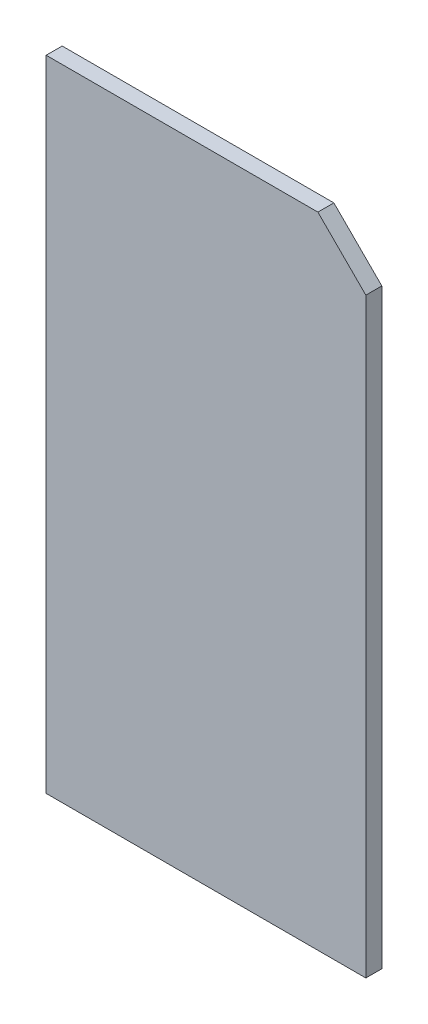
ISO-10303-21;
HEADER;
FILE_DESCRIPTION(('STEP AP214'),'2;1');
FILE_NAME('part.step','',(''),(''),'','','');
FILE_SCHEMA(('AUTOMOTIVE_DESIGN { 1 0 10303 214 1 1 1 1 }'));
ENDSEC;
DATA;
#1=APPLICATION_CONTEXT('core data for automotive mechanical design processes');
#2=APPLICATION_PROTOCOL_DEFINITION('international standard','automotive_design',2000,#1);
#3=PRODUCT_CONTEXT('',#1,'mechanical');
#4=PRODUCT('Part','Part','',(#3));
#5=PRODUCT_RELATED_PRODUCT_CATEGORY('part','',(#4));
#6=PRODUCT_DEFINITION_FORMATION('','',#4);
#7=PRODUCT_DEFINITION_CONTEXT('part definition',#1,'design');
#8=PRODUCT_DEFINITION('design','',#6,#7);
#9=PRODUCT_DEFINITION_SHAPE('','',#8);
#10=(LENGTH_UNIT() NAMED_UNIT(*) SI_UNIT(.MILLI.,.METRE.));
#11=(NAMED_UNIT(*) PLANE_ANGLE_UNIT() SI_UNIT($,.RADIAN.));
#12=(NAMED_UNIT(*) SI_UNIT($,.STERADIAN.) SOLID_ANGLE_UNIT());
#13=UNCERTAINTY_MEASURE_WITH_UNIT(LENGTH_MEASURE(1.E-05),#10,'distance_accuracy_value','');
#14=(GEOMETRIC_REPRESENTATION_CONTEXT(3) GLOBAL_UNCERTAINTY_ASSIGNED_CONTEXT((#13)) GLOBAL_UNIT_ASSIGNED_CONTEXT((#10,
#11,#12)) REPRESENTATION_CONTEXT('',''));
#15=CARTESIAN_POINT('',(0.,0.,0.));
#16=DIRECTION('',(0.,0.,1.));
#17=DIRECTION('',(1.,0.,0.));
#18=AXIS2_PLACEMENT_3D('',#15,#16,#17);
#19=CARTESIAN_POINT('',(-250.,-500.,25.));
#20=DIRECTION('',(1.,0.,0.));
#21=DIRECTION('',(0.,0.,-1.));
#22=AXIS2_PLACEMENT_3D('',#19,#20,#21);
#23=PLANE('',#22);
#24=DIRECTION('',(0.,-1.,0.));
#25=VECTOR('',#24,1.);
#26=CARTESIAN_POINT('',(-250.,-500.,0.));
#27=LINE('',#26,#25);
#28=CARTESIAN_POINT('',(-250.,500.,0.));
#29=VERTEX_POINT('',#28);
#30=CARTESIAN_POINT('',(-250.,-500.,0.));
#31=VERTEX_POINT('',#30);
#32=EDGE_CURVE('E116',#29,#31,#27,.T.);
#33=ORIENTED_EDGE('',*,*,#32,.T.);
#34=DIRECTION('',(0.,0.,-1.));
#35=VECTOR('',#34,1.);
#36=CARTESIAN_POINT('',(-250.,-500.,25.));
#37=LINE('',#36,#35);
#38=CARTESIAN_POINT('',(-250.,-500.,25.));
#39=VERTEX_POINT('',#38);
#40=EDGE_CURVE('E47',#39,#31,#37,.T.);
#41=ORIENTED_EDGE('',*,*,#40,.F.);
#42=DIRECTION('',(0.,-1.,0.));
#43=VECTOR('',#42,1.);
#44=CARTESIAN_POINT('',(-250.,-500.,25.));
#45=LINE('',#44,#43);
#46=CARTESIAN_POINT('',(-250.,500.,25.));
#47=VERTEX_POINT('',#46);
#48=EDGE_CURVE('E128',#47,#39,#45,.T.);
#49=ORIENTED_EDGE('',*,*,#48,.F.);
#50=DIRECTION('',(0.,0.,-1.));
#51=VECTOR('',#50,1.);
#52=CARTESIAN_POINT('',(-250.,500.,25.));
#53=LINE('',#52,#51);
#54=EDGE_CURVE('E105',#47,#29,#53,.T.);
#55=ORIENTED_EDGE('',*,*,#54,.T.);
#56=EDGE_LOOP('',(#33,#41,#49,#55));
#57=FACE_BOUND('',#56,.T.);
#58=ADVANCED_FACE('F39',(#57),#23,.F.);
#59=CARTESIAN_POINT('',(-250.,-500.,25.));
#60=DIRECTION('',(0.,1.,0.));
#61=DIRECTION('',(0.,0.,1.));
#62=AXIS2_PLACEMENT_3D('',#59,#60,#61);
#63=PLANE('',#62);
#64=DIRECTION('',(1.,0.,0.));
#65=VECTOR('',#64,1.);
#66=CARTESIAN_POINT('',(-250.,-500.,0.));
#67=LINE('',#66,#65);
#68=CARTESIAN_POINT('',(250.,-500.,0.));
#69=VERTEX_POINT('',#68);
#70=EDGE_CURVE('E120',#31,#69,#67,.T.);
#71=ORIENTED_EDGE('',*,*,#70,.T.);
#72=DIRECTION('',(0.,0.,-1.));
#73=VECTOR('',#72,1.);
#74=CARTESIAN_POINT('',(250.,-500.,25.));
#75=LINE('',#74,#73);
#76=CARTESIAN_POINT('',(250.,-500.,25.));
#77=VERTEX_POINT('',#76);
#78=EDGE_CURVE('E111',#77,#69,#75,.T.);
#79=ORIENTED_EDGE('',*,*,#78,.F.);
#80=DIRECTION('',(1.,0.,0.));
#81=VECTOR('',#80,1.);
#82=CARTESIAN_POINT('',(-250.,-500.,25.));
#83=LINE('',#82,#81);
#84=EDGE_CURVE('E86',#39,#77,#83,.T.);
#85=ORIENTED_EDGE('',*,*,#84,.F.);
#86=ORIENTED_EDGE('',*,*,#40,.T.);
#87=EDGE_LOOP('',(#71,#79,#85,#86));
#88=FACE_BOUND('',#87,.T.);
#89=ADVANCED_FACE('F134',(#88),#63,.F.);
#90=CARTESIAN_POINT('',(250.,500.,25.));
#91=DIRECTION('',(-1.,0.,0.));
#92=DIRECTION('',(0.,-1.,0.));
#93=AXIS2_PLACEMENT_3D('',#90,#91,#92);
#94=PLANE('',#93);
#95=DIRECTION('',(0.,1.,0.));
#96=VECTOR('',#95,1.);
#97=CARTESIAN_POINT('',(250.,500.,0.));
#98=LINE('',#97,#96);
#99=CARTESIAN_POINT('',(250.,425.,0.));
#100=VERTEX_POINT('',#99);
#101=EDGE_CURVE('E123',#69,#100,#98,.T.);
#102=ORIENTED_EDGE('',*,*,#101,.T.);
#103=DIRECTION('',(0.,0.,1.));
#104=VECTOR('',#103,1.);
#105=CARTESIAN_POINT('',(250.,425.,-0.399999999999998));
#106=LINE('',#105,#104);
#107=CARTESIAN_POINT('',(250.,425.,25.));
#108=VERTEX_POINT('',#107);
#109=EDGE_CURVE('E53',#100,#108,#106,.T.);
#110=ORIENTED_EDGE('',*,*,#109,.T.);
#111=DIRECTION('',(0.,1.,0.));
#112=VECTOR('',#111,1.);
#113=CARTESIAN_POINT('',(250.,500.,25.));
#114=LINE('',#113,#112);
#115=EDGE_CURVE('E101',#77,#108,#114,.T.);
#116=ORIENTED_EDGE('',*,*,#115,.F.);
#117=ORIENTED_EDGE('',*,*,#78,.T.);
#118=EDGE_LOOP('',(#102,#110,#116,#117));
#119=FACE_BOUND('',#118,.T.);
#120=ADVANCED_FACE('F141',(#119),#94,.F.);
#121=CARTESIAN_POINT('',(-250.,500.,25.));
#122=DIRECTION('',(0.,-1.,0.));
#123=DIRECTION('',(0.,0.,-1.));
#124=AXIS2_PLACEMENT_3D('',#121,#122,#123);
#125=PLANE('',#124);
#126=DIRECTION('',(-1.,0.,0.));
#127=VECTOR('',#126,1.);
#128=CARTESIAN_POINT('',(-250.,500.,25.));
#129=LINE('',#128,#127);
#130=CARTESIAN_POINT('',(175.,500.,25.));
#131=VERTEX_POINT('',#130);
#132=EDGE_CURVE('E62',#131,#47,#129,.T.);
#133=ORIENTED_EDGE('',*,*,#132,.F.);
#134=DIRECTION('',(0.,0.,1.));
#135=VECTOR('',#134,1.);
#136=CARTESIAN_POINT('',(175.,500.,-0.399999999999998));
#137=LINE('',#136,#135);
#138=CARTESIAN_POINT('',(175.,500.,0.));
#139=VERTEX_POINT('',#138);
#140=EDGE_CURVE('E93',#139,#131,#137,.T.);
#141=ORIENTED_EDGE('',*,*,#140,.F.);
#142=DIRECTION('',(-1.,0.,0.));
#143=VECTOR('',#142,1.);
#144=CARTESIAN_POINT('',(-250.,500.,0.));
#145=LINE('',#144,#143);
#146=EDGE_CURVE('E80',#139,#29,#145,.T.);
#147=ORIENTED_EDGE('',*,*,#146,.T.);
#148=ORIENTED_EDGE('',*,*,#54,.F.);
#149=EDGE_LOOP('',(#133,#141,#147,#148));
#150=FACE_BOUND('',#149,.T.);
#151=ADVANCED_FACE('F104',(#150),#125,.F.);
#152=CARTESIAN_POINT('',(0.,0.,25.));
#153=DIRECTION('',(0.,0.,-1.));
#154=DIRECTION('',(-1.,0.,0.));
#155=AXIS2_PLACEMENT_3D('',#152,#153,#154);
#156=PLANE('',#155);
#157=ORIENTED_EDGE('',*,*,#115,.T.);
#158=DIRECTION('',(0.707106781186548,-0.707106781186548,0.));
#159=VECTOR('',#158,1.);
#160=CARTESIAN_POINT('',(175.,500.,25.));
#161=LINE('',#160,#159);
#162=EDGE_CURVE('E95',#131,#108,#161,.T.);
#163=ORIENTED_EDGE('',*,*,#162,.F.);
#164=ORIENTED_EDGE('',*,*,#132,.T.);
#165=ORIENTED_EDGE('',*,*,#48,.T.);
#166=ORIENTED_EDGE('',*,*,#84,.T.);
#167=EDGE_LOOP('',(#157,#163,#164,#165,#166));
#168=FACE_BOUND('',#167,.T.);
#169=ADVANCED_FACE('F99',(#168),#156,.F.);
#170=CARTESIAN_POINT('',(0.,0.,0.));
#171=DIRECTION('',(0.,0.,-1.));
#172=DIRECTION('',(-1.,0.,0.));
#173=AXIS2_PLACEMENT_3D('',#170,#171,#172);
#174=PLANE('',#173);
#175=DIRECTION('',(-0.707106781186548,0.707106781186548,0.));
#176=VECTOR('',#175,1.);
#177=CARTESIAN_POINT('',(337.5,337.5,0.));
#178=LINE('',#177,#176);
#179=EDGE_CURVE('E11',#100,#139,#178,.T.);
#180=ORIENTED_EDGE('',*,*,#179,.F.);
#181=ORIENTED_EDGE('',*,*,#101,.F.);
#182=ORIENTED_EDGE('',*,*,#70,.F.);
#183=ORIENTED_EDGE('',*,*,#32,.F.);
#184=ORIENTED_EDGE('',*,*,#146,.F.);
#185=EDGE_LOOP('',(#180,#181,#182,#183,#184));
#186=FACE_BOUND('',#185,.T.);
#187=ADVANCED_FACE('F138',(#186),#174,.T.);
#188=CARTESIAN_POINT('',(175.,500.,-0.399999999999998));
#189=DIRECTION('',(-0.707106781186548,-0.707106781186548,0.));
#190=DIRECTION('',(0.707106781186548,-0.707106781186548,0.));
#191=AXIS2_PLACEMENT_3D('',#188,#189,#190);
#192=PLANE('',#191);
#193=ORIENTED_EDGE('',*,*,#179,.T.);
#194=ORIENTED_EDGE('',*,*,#140,.T.);
#195=ORIENTED_EDGE('',*,*,#162,.T.);
#196=ORIENTED_EDGE('',*,*,#109,.F.);
#197=EDGE_LOOP('',(#193,#194,#195,#196));
#198=FACE_BOUND('',#197,.T.);
#199=ADVANCED_FACE('F94',(#198),#192,.F.);
#200=CLOSED_SHELL('',(#58,#89,#120,#151,#169,#187,#199));
#201=MANIFOLD_SOLID_BREP('B2',#200);
#202=ADVANCED_BREP_SHAPE_REPRESENTATION('',(#18,#201),#14);
#203=SHAPE_DEFINITION_REPRESENTATION(#9,#202);
ENDSEC;
END-ISO-10303-21;
